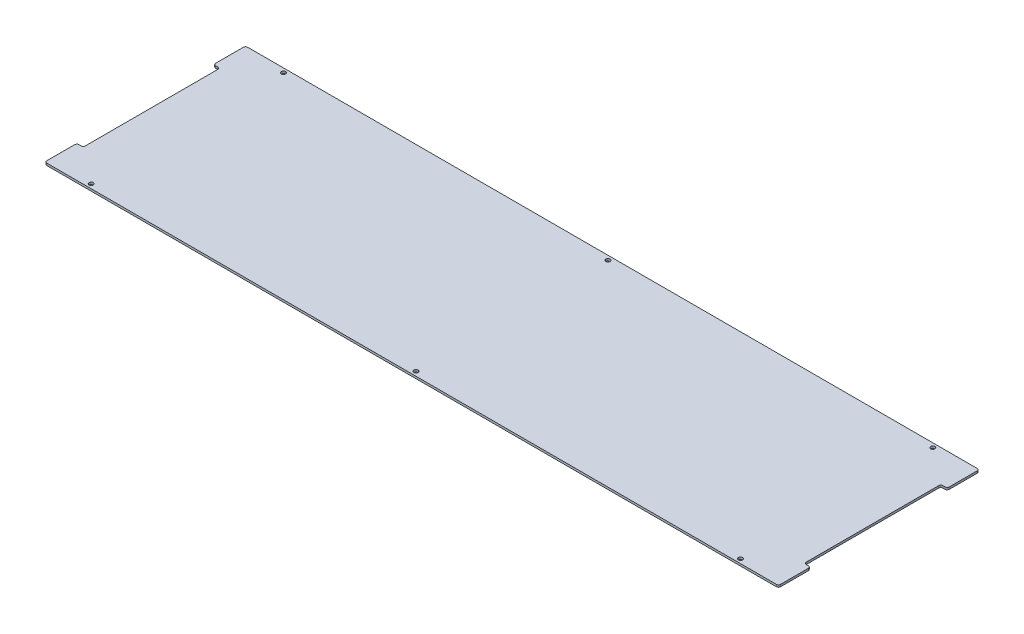
ISO-10303-21;
HEADER;
FILE_DESCRIPTION(('STEP AP214'),'2;1');
FILE_NAME('part.step','',(''),(''),'','','');
FILE_SCHEMA(('AUTOMOTIVE_DESIGN { 1 0 10303 214 1 1 1 1 }'));
ENDSEC;
DATA;
#1=APPLICATION_CONTEXT('core data for automotive mechanical design processes');
#2=APPLICATION_PROTOCOL_DEFINITION('international standard','automotive_design',2000,#1);
#3=PRODUCT_CONTEXT('',#1,'mechanical');
#4=PRODUCT('Part','Part','',(#3));
#5=PRODUCT_RELATED_PRODUCT_CATEGORY('part','',(#4));
#6=PRODUCT_DEFINITION_FORMATION('','',#4);
#7=PRODUCT_DEFINITION_CONTEXT('part definition',#1,'design');
#8=PRODUCT_DEFINITION('design','',#6,#7);
#9=PRODUCT_DEFINITION_SHAPE('','',#8);
#10=(LENGTH_UNIT() NAMED_UNIT(*) SI_UNIT(.MILLI.,.METRE.));
#11=(NAMED_UNIT(*) PLANE_ANGLE_UNIT() SI_UNIT($,.RADIAN.));
#12=(NAMED_UNIT(*) SI_UNIT($,.STERADIAN.) SOLID_ANGLE_UNIT());
#13=UNCERTAINTY_MEASURE_WITH_UNIT(LENGTH_MEASURE(1.E-05),#10,'distance_accuracy_value','');
#14=(GEOMETRIC_REPRESENTATION_CONTEXT(3) GLOBAL_UNCERTAINTY_ASSIGNED_CONTEXT((#13)) GLOBAL_UNIT_ASSIGNED_CONTEXT((#10,
#11,#12)) REPRESENTATION_CONTEXT('',''));
#15=CARTESIAN_POINT('',(0.,0.,0.));
#16=DIRECTION('',(0.,0.,1.));
#17=DIRECTION('',(1.,0.,0.));
#18=AXIS2_PLACEMENT_3D('',#15,#16,#17);
#19=CARTESIAN_POINT('',(0.,3.175,0.));
#20=DIRECTION('',(0.,-1.,0.));
#21=DIRECTION('',(0.,0.,-1.));
#22=AXIS2_PLACEMENT_3D('',#19,#20,#21);
#23=PLANE('',#22);
#24=CARTESIAN_POINT('',(482.6,3.175,142.875));
#25=DIRECTION('',(0.,1.,0.));
#26=DIRECTION('',(0.,0.,1.));
#27=AXIS2_PLACEMENT_3D('',#24,#25,#26);
#28=CIRCLE('',#27,3.17499999999998);
#29=CARTESIAN_POINT('',(482.6,3.175,146.05));
#30=VERTEX_POINT('',#29);
#31=EDGE_CURVE('E945',#30,#30,#28,.T.);
#32=ORIENTED_EDGE('',*,*,#31,.F.);
#33=EDGE_LOOP('',(#32));
#34=FACE_BOUND('',#33,.T.);
#35=CARTESIAN_POINT('',(-482.6,3.175,142.875));
#36=DIRECTION('',(0.,1.,0.));
#37=DIRECTION('',(0.,0.,1.));
#38=AXIS2_PLACEMENT_3D('',#35,#36,#37);
#39=CIRCLE('',#38,3.17499999999998);
#40=CARTESIAN_POINT('',(-482.6,3.175,146.05));
#41=VERTEX_POINT('',#40);
#42=EDGE_CURVE('E929',#41,#41,#39,.T.);
#43=ORIENTED_EDGE('',*,*,#42,.F.);
#44=EDGE_LOOP('',(#43));
#45=FACE_BOUND('',#44,.T.);
#46=CARTESIAN_POINT('',(482.6,3.175,-142.875));
#47=DIRECTION('',(0.,1.,0.));
#48=DIRECTION('',(0.,0.,1.));
#49=AXIS2_PLACEMENT_3D('',#46,#47,#48);
#50=CIRCLE('',#49,3.17499999999998);
#51=CARTESIAN_POINT('',(482.6,3.175,-139.7));
#52=VERTEX_POINT('',#51);
#53=EDGE_CURVE('E921',#52,#52,#50,.T.);
#54=ORIENTED_EDGE('',*,*,#53,.F.);
#55=EDGE_LOOP('',(#54));
#56=FACE_BOUND('',#55,.T.);
#57=CARTESIAN_POINT('',(0.,3.175,-142.875));
#58=DIRECTION('',(0.,1.,0.));
#59=DIRECTION('',(0.,0.,1.));
#60=AXIS2_PLACEMENT_3D('',#57,#58,#59);
#61=CIRCLE('',#60,3.17499999999999);
#62=CARTESIAN_POINT('',(0.,3.175,-139.7));
#63=VERTEX_POINT('',#62);
#64=EDGE_CURVE('E913',#63,#63,#61,.T.);
#65=ORIENTED_EDGE('',*,*,#64,.F.);
#66=EDGE_LOOP('',(#65));
#67=FACE_BOUND('',#66,.T.);
#68=CARTESIAN_POINT('',(-482.6,3.175,-142.875));
#69=DIRECTION('',(0.,1.,0.));
#70=DIRECTION('',(0.,0.,1.));
#71=AXIS2_PLACEMENT_3D('',#68,#69,#70);
#72=CIRCLE('',#71,3.17499999999998);
#73=CARTESIAN_POINT('',(-482.6,3.175,-139.7));
#74=VERTEX_POINT('',#73);
#75=EDGE_CURVE('E905',#74,#74,#72,.T.);
#76=ORIENTED_EDGE('',*,*,#75,.F.);
#77=EDGE_LOOP('',(#76));
#78=FACE_BOUND('',#77,.T.);
#79=DIRECTION('',(0.,0.,1.));
#80=VECTOR('',#79,1.);
#81=CARTESIAN_POINT('',(-545.30625,3.175,149.225));
#82=LINE('',#81,#80);
#83=CARTESIAN_POINT('',(-545.30625,3.175,104.775));
#84=VERTEX_POINT('',#83);
#85=CARTESIAN_POINT('',(-545.30625,3.175,146.05));
#86=VERTEX_POINT('',#85);
#87=EDGE_CURVE('E279',#84,#86,#82,.T.);
#88=ORIENTED_EDGE('',*,*,#87,.T.);
#89=CARTESIAN_POINT('',(-542.13125,3.175,146.05));
#90=DIRECTION('',(0.,-1.,0.));
#91=DIRECTION('',(0.,0.,-1.));
#92=AXIS2_PLACEMENT_3D('',#89,#90,#91);
#93=CIRCLE('',#92,3.175);
#94=CARTESIAN_POINT('',(-542.13125,3.175,149.225));
#95=VERTEX_POINT('',#94);
#96=EDGE_CURVE('E402',#86,#95,#93,.F.);
#97=ORIENTED_EDGE('',*,*,#96,.T.);
#98=DIRECTION('',(1.,0.,0.));
#99=VECTOR('',#98,1.);
#100=CARTESIAN_POINT('',(-545.30625,3.175,149.225));
#101=LINE('',#100,#99);
#102=CARTESIAN_POINT('',(542.13125,3.175,149.225));
#103=VERTEX_POINT('',#102);
#104=EDGE_CURVE('E251',#95,#103,#101,.T.);
#105=ORIENTED_EDGE('',*,*,#104,.T.);
#106=CARTESIAN_POINT('',(542.13125,3.175,146.05));
#107=DIRECTION('',(0.,-1.,0.));
#108=DIRECTION('',(0.,0.,-1.));
#109=AXIS2_PLACEMENT_3D('',#106,#107,#108);
#110=CIRCLE('',#109,3.175);
#111=CARTESIAN_POINT('',(545.30625,3.175,146.05));
#112=VERTEX_POINT('',#111);
#113=EDGE_CURVE('E392',#103,#112,#110,.F.);
#114=ORIENTED_EDGE('',*,*,#113,.T.);
#115=DIRECTION('',(0.,0.,-1.));
#116=VECTOR('',#115,1.);
#117=CARTESIAN_POINT('',(545.30625,3.175,149.225));
#118=LINE('',#117,#116);
#119=CARTESIAN_POINT('',(545.30625,3.175,104.775));
#120=VERTEX_POINT('',#119);
#121=EDGE_CURVE('E274',#112,#120,#118,.T.);
#122=ORIENTED_EDGE('',*,*,#121,.T.);
#123=CARTESIAN_POINT('',(542.13125,3.175,104.775));
#124=DIRECTION('',(0.,-1.,0.));
#125=DIRECTION('',(0.,0.,-1.));
#126=AXIS2_PLACEMENT_3D('',#123,#124,#125);
#127=CIRCLE('',#126,3.175);
#128=CARTESIAN_POINT('',(542.13125,3.175,101.6));
#129=VERTEX_POINT('',#128);
#130=EDGE_CURVE('E256',#120,#129,#127,.F.);
#131=ORIENTED_EDGE('',*,*,#130,.T.);
#132=DIRECTION('',(1.,0.,0.));
#133=VECTOR('',#132,1.);
#134=CARTESIAN_POINT('',(545.30625,3.175,101.6));
#135=LINE('',#134,#133);
#136=CARTESIAN_POINT('',(538.95625,3.175,101.6));
#137=VERTEX_POINT('',#136);
#138=EDGE_CURVE('E245',#137,#129,#135,.T.);
#139=ORIENTED_EDGE('',*,*,#138,.F.);
#140=CARTESIAN_POINT('',(538.95625,3.175,98.425));
#141=DIRECTION('',(0.,-1.,0.));
#142=DIRECTION('',(0.,0.,-1.));
#143=AXIS2_PLACEMENT_3D('',#140,#141,#142);
#144=CIRCLE('',#143,3.175);
#145=CARTESIAN_POINT('',(535.78125,3.175,98.4249999999999));
#146=VERTEX_POINT('',#145);
#147=EDGE_CURVE('E228',#137,#146,#144,.T.);
#148=ORIENTED_EDGE('',*,*,#147,.T.);
#149=DIRECTION('',(0.,0.,1.));
#150=VECTOR('',#149,1.);
#151=CARTESIAN_POINT('',(535.78125,3.175,-101.6));
#152=LINE('',#151,#150);
#153=CARTESIAN_POINT('',(535.78125,3.175,-98.425));
#154=VERTEX_POINT('',#153);
#155=EDGE_CURVE('E259',#154,#146,#152,.T.);
#156=ORIENTED_EDGE('',*,*,#155,.F.);
#157=CARTESIAN_POINT('',(538.95625,3.175,-98.425));
#158=DIRECTION('',(0.,-1.,0.));
#159=DIRECTION('',(0.,0.,-1.));
#160=AXIS2_PLACEMENT_3D('',#157,#158,#159);
#161=CIRCLE('',#160,3.175);
#162=CARTESIAN_POINT('',(538.95625,3.175,-101.6));
#163=VERTEX_POINT('',#162);
#164=EDGE_CURVE('E313',#154,#163,#161,.T.);
#165=ORIENTED_EDGE('',*,*,#164,.T.);
#166=DIRECTION('',(-1.,0.,0.));
#167=VECTOR('',#166,1.);
#168=CARTESIAN_POINT('',(545.30625,3.175,-101.6));
#169=LINE('',#168,#167);
#170=CARTESIAN_POINT('',(542.13125,3.175,-101.6));
#171=VERTEX_POINT('',#170);
#172=EDGE_CURVE('E266',#171,#163,#169,.T.);
#173=ORIENTED_EDGE('',*,*,#172,.F.);
#174=CARTESIAN_POINT('',(542.13125,3.175,-104.775));
#175=DIRECTION('',(0.,-1.,0.));
#176=DIRECTION('',(0.,0.,-1.));
#177=AXIS2_PLACEMENT_3D('',#174,#175,#176);
#178=CIRCLE('',#177,3.175);
#179=CARTESIAN_POINT('',(545.30625,3.175,-104.775));
#180=VERTEX_POINT('',#179);
#181=EDGE_CURVE('E387',#171,#180,#178,.F.);
#182=ORIENTED_EDGE('',*,*,#181,.T.);
#183=CARTESIAN_POINT('',(545.30625,3.175,-146.05));
#184=VERTEX_POINT('',#183);
#185=EDGE_CURVE('E270',#180,#184,#118,.T.);
#186=ORIENTED_EDGE('',*,*,#185,.T.);
#187=CARTESIAN_POINT('',(542.13125,3.175,-146.05));
#188=DIRECTION('',(0.,-1.,0.));
#189=DIRECTION('',(0.,0.,-1.));
#190=AXIS2_PLACEMENT_3D('',#187,#188,#189);
#191=CIRCLE('',#190,3.175);
#192=CARTESIAN_POINT('',(542.13125,3.175,-149.225));
#193=VERTEX_POINT('',#192);
#194=EDGE_CURVE('E384',#184,#193,#191,.F.);
#195=ORIENTED_EDGE('',*,*,#194,.T.);
#196=DIRECTION('',(-1.,0.,0.));
#197=VECTOR('',#196,1.);
#198=CARTESIAN_POINT('',(-545.30625,3.175,-149.225));
#199=LINE('',#198,#197);
#200=CARTESIAN_POINT('',(-542.13125,3.175,-149.225));
#201=VERTEX_POINT('',#200);
#202=EDGE_CURVE('E276',#193,#201,#199,.T.);
#203=ORIENTED_EDGE('',*,*,#202,.T.);
#204=CARTESIAN_POINT('',(-542.13125,3.175,-146.05));
#205=DIRECTION('',(0.,-1.,0.));
#206=DIRECTION('',(0.,0.,-1.));
#207=AXIS2_PLACEMENT_3D('',#204,#205,#206);
#208=CIRCLE('',#207,3.175);
#209=CARTESIAN_POINT('',(-545.30625,3.175,-146.05));
#210=VERTEX_POINT('',#209);
#211=EDGE_CURVE('E88',#201,#210,#208,.F.);
#212=ORIENTED_EDGE('',*,*,#211,.T.);
#213=CARTESIAN_POINT('',(-545.30625,3.175,-104.775));
#214=VERTEX_POINT('',#213);
#215=EDGE_CURVE('E280',#210,#214,#82,.T.);
#216=ORIENTED_EDGE('',*,*,#215,.T.);
#217=CARTESIAN_POINT('',(-542.13125,3.175,-104.775));
#218=DIRECTION('',(0.,-1.,0.));
#219=DIRECTION('',(0.,0.,-1.));
#220=AXIS2_PLACEMENT_3D('',#217,#218,#219);
#221=CIRCLE('',#220,3.175);
#222=CARTESIAN_POINT('',(-542.13125,3.175,-101.6));
#223=VERTEX_POINT('',#222);
#224=EDGE_CURVE('E80',#214,#223,#221,.F.);
#225=ORIENTED_EDGE('',*,*,#224,.T.);
#226=DIRECTION('',(1.,0.,0.));
#227=VECTOR('',#226,1.);
#228=CARTESIAN_POINT('',(-545.30625,3.175,-101.6));
#229=LINE('',#228,#227);
#230=CARTESIAN_POINT('',(-538.95625,3.175,-101.6));
#231=VERTEX_POINT('',#230);
#232=EDGE_CURVE('E470',#223,#231,#229,.T.);
#233=ORIENTED_EDGE('',*,*,#232,.T.);
#234=CARTESIAN_POINT('',(-538.95625,3.175,-98.425));
#235=DIRECTION('',(0.,-1.,0.));
#236=DIRECTION('',(0.,0.,-1.));
#237=AXIS2_PLACEMENT_3D('',#234,#235,#236);
#238=CIRCLE('',#237,3.175);
#239=CARTESIAN_POINT('',(-535.78125,3.175,-98.425));
#240=VERTEX_POINT('',#239);
#241=EDGE_CURVE('E340',#231,#240,#238,.T.);
#242=ORIENTED_EDGE('',*,*,#241,.T.);
#243=DIRECTION('',(0.,0.,1.));
#244=VECTOR('',#243,1.);
#245=CARTESIAN_POINT('',(-535.78125,3.175,-101.6));
#246=LINE('',#245,#244);
#247=CARTESIAN_POINT('',(-535.78125,3.175,98.4249999999999));
#248=VERTEX_POINT('',#247);
#249=EDGE_CURVE('E478',#240,#248,#246,.T.);
#250=ORIENTED_EDGE('',*,*,#249,.T.);
#251=CARTESIAN_POINT('',(-538.95625,3.175,98.425));
#252=DIRECTION('',(0.,-1.,0.));
#253=DIRECTION('',(0.,0.,-1.));
#254=AXIS2_PLACEMENT_3D('',#251,#252,#253);
#255=CIRCLE('',#254,3.175);
#256=CARTESIAN_POINT('',(-538.95625,3.175,101.6));
#257=VERTEX_POINT('',#256);
#258=EDGE_CURVE('E334',#248,#257,#255,.T.);
#259=ORIENTED_EDGE('',*,*,#258,.T.);
#260=DIRECTION('',(-1.,0.,0.));
#261=VECTOR('',#260,1.);
#262=CARTESIAN_POINT('',(-545.30625,3.175,101.6));
#263=LINE('',#262,#261);
#264=CARTESIAN_POINT('',(-542.13125,3.175,101.6));
#265=VERTEX_POINT('',#264);
#266=EDGE_CURVE('E495',#257,#265,#263,.T.);
#267=ORIENTED_EDGE('',*,*,#266,.T.);
#268=CARTESIAN_POINT('',(-542.13125,3.175,104.775));
#269=DIRECTION('',(0.,-1.,0.));
#270=DIRECTION('',(0.,0.,-1.));
#271=AXIS2_PLACEMENT_3D('',#268,#269,#270);
#272=CIRCLE('',#271,3.175);
#273=EDGE_CURVE('E399',#265,#84,#272,.F.);
#274=ORIENTED_EDGE('',*,*,#273,.T.);
#275=EDGE_LOOP('',(#88,#97,#105,#114,#122,#131,#139,#148,#156,#165,#173,#182,#186,#195,#203,
#212,#216,#225,#233,#242,#250,#259,#267,#274));
#276=FACE_BOUND('',#275,.T.);
#277=CARTESIAN_POINT('',(0.,3.175,142.875));
#278=DIRECTION('',(0.,1.,0.));
#279=DIRECTION('',(0.,0.,1.));
#280=AXIS2_PLACEMENT_3D('',#277,#278,#279);
#281=CIRCLE('',#280,3.17499999999999);
#282=CARTESIAN_POINT('',(0.,3.175,146.05));
#283=VERTEX_POINT('',#282);
#284=EDGE_CURVE('E937',#283,#283,#281,.T.);
#285=ORIENTED_EDGE('',*,*,#284,.F.);
#286=EDGE_LOOP('',(#285));
#287=FACE_BOUND('',#286,.T.);
#288=ADVANCED_FACE('F64',(#34,#45,#56,#67,#78,#276,#287),#23,.F.);
#289=CARTESIAN_POINT('',(0.,0.,0.));
#290=DIRECTION('',(0.,-1.,0.));
#291=DIRECTION('',(0.,0.,-1.));
#292=AXIS2_PLACEMENT_3D('',#289,#290,#291);
#293=PLANE('',#292);
#294=CARTESIAN_POINT('',(482.6,0.,142.875));
#295=DIRECTION('',(0.,1.,0.));
#296=DIRECTION('',(0.,0.,1.));
#297=AXIS2_PLACEMENT_3D('',#294,#295,#296);
#298=CIRCLE('',#297,3.17499999999998);
#299=CARTESIAN_POINT('',(482.6,0.,146.05));
#300=VERTEX_POINT('',#299);
#301=EDGE_CURVE('E941',#300,#300,#298,.T.);
#302=ORIENTED_EDGE('',*,*,#301,.T.);
#303=EDGE_LOOP('',(#302));
#304=FACE_BOUND('',#303,.T.);
#305=DIRECTION('',(1.,0.,0.));
#306=VECTOR('',#305,1.);
#307=CARTESIAN_POINT('',(-545.30625,0.,149.225));
#308=LINE('',#307,#306);
#309=CARTESIAN_POINT('',(-542.13125,0.,149.225));
#310=VERTEX_POINT('',#309);
#311=CARTESIAN_POINT('',(542.13125,0.,149.225));
#312=VERTEX_POINT('',#311);
#313=EDGE_CURVE('E275',#310,#312,#308,.T.);
#314=ORIENTED_EDGE('',*,*,#313,.F.);
#315=CARTESIAN_POINT('',(-542.13125,0.,146.05));
#316=DIRECTION('',(0.,-1.,0.));
#317=DIRECTION('',(0.,0.,-1.));
#318=AXIS2_PLACEMENT_3D('',#315,#316,#317);
#319=CIRCLE('',#318,3.175);
#320=CARTESIAN_POINT('',(-545.30625,0.,146.05));
#321=VERTEX_POINT('',#320);
#322=EDGE_CURVE('E375',#310,#321,#319,.T.);
#323=ORIENTED_EDGE('',*,*,#322,.T.);
#324=DIRECTION('',(0.,0.,1.));
#325=VECTOR('',#324,1.);
#326=CARTESIAN_POINT('',(-545.30625,0.,149.225));
#327=LINE('',#326,#325);
#328=CARTESIAN_POINT('',(-545.30625,0.,104.775));
#329=VERTEX_POINT('',#328);
#330=EDGE_CURVE('E295',#329,#321,#327,.T.);
#331=ORIENTED_EDGE('',*,*,#330,.F.);
#332=CARTESIAN_POINT('',(-542.13125,0.,104.775));
#333=DIRECTION('',(0.,-1.,0.));
#334=DIRECTION('',(0.,0.,-1.));
#335=AXIS2_PLACEMENT_3D('',#332,#333,#334);
#336=CIRCLE('',#335,3.175);
#337=CARTESIAN_POINT('',(-542.13125,0.,101.6));
#338=VERTEX_POINT('',#337);
#339=EDGE_CURVE('E372',#329,#338,#336,.T.);
#340=ORIENTED_EDGE('',*,*,#339,.T.);
#341=DIRECTION('',(-1.,0.,0.));
#342=VECTOR('',#341,1.);
#343=CARTESIAN_POINT('',(-545.30625,0.,101.6));
#344=LINE('',#343,#342);
#345=CARTESIAN_POINT('',(-538.95625,0.,101.6));
#346=VERTEX_POINT('',#345);
#347=EDGE_CURVE('E477',#346,#338,#344,.T.);
#348=ORIENTED_EDGE('',*,*,#347,.F.);
#349=CARTESIAN_POINT('',(-538.95625,0.,98.425));
#350=DIRECTION('',(0.,-1.,0.));
#351=DIRECTION('',(0.,0.,-1.));
#352=AXIS2_PLACEMENT_3D('',#349,#350,#351);
#353=CIRCLE('',#352,3.175);
#354=CARTESIAN_POINT('',(-535.78125,0.,98.4249999999999));
#355=VERTEX_POINT('',#354);
#356=EDGE_CURVE('E337',#346,#355,#353,.F.);
#357=ORIENTED_EDGE('',*,*,#356,.T.);
#358=DIRECTION('',(0.,0.,1.));
#359=VECTOR('',#358,1.);
#360=CARTESIAN_POINT('',(-535.78125,0.,-101.6));
#361=LINE('',#360,#359);
#362=CARTESIAN_POINT('',(-535.78125,0.,-98.425));
#363=VERTEX_POINT('',#362);
#364=EDGE_CURVE('E486',#363,#355,#361,.T.);
#365=ORIENTED_EDGE('',*,*,#364,.F.);
#366=CARTESIAN_POINT('',(-538.95625,0.,-98.425));
#367=DIRECTION('',(0.,-1.,0.));
#368=DIRECTION('',(0.,0.,-1.));
#369=AXIS2_PLACEMENT_3D('',#366,#367,#368);
#370=CIRCLE('',#369,3.175);
#371=CARTESIAN_POINT('',(-538.95625,0.,-101.6));
#372=VERTEX_POINT('',#371);
#373=EDGE_CURVE('E343',#363,#372,#370,.F.);
#374=ORIENTED_EDGE('',*,*,#373,.T.);
#375=DIRECTION('',(1.,0.,0.));
#376=VECTOR('',#375,1.);
#377=CARTESIAN_POINT('',(-545.30625,0.,-101.6));
#378=LINE('',#377,#376);
#379=CARTESIAN_POINT('',(-542.13125,0.,-101.6));
#380=VERTEX_POINT('',#379);
#381=EDGE_CURVE('E482',#380,#372,#378,.T.);
#382=ORIENTED_EDGE('',*,*,#381,.F.);
#383=CARTESIAN_POINT('',(-542.13125,0.,-104.775));
#384=DIRECTION('',(0.,-1.,0.));
#385=DIRECTION('',(0.,0.,-1.));
#386=AXIS2_PLACEMENT_3D('',#383,#384,#385);
#387=CIRCLE('',#386,3.175);
#388=CARTESIAN_POINT('',(-545.30625,0.,-104.775));
#389=VERTEX_POINT('',#388);
#390=EDGE_CURVE('E369',#380,#389,#387,.T.);
#391=ORIENTED_EDGE('',*,*,#390,.T.);
#392=CARTESIAN_POINT('',(-545.30625,0.,-146.05));
#393=VERTEX_POINT('',#392);
#394=EDGE_CURVE('E299',#393,#389,#327,.T.);
#395=ORIENTED_EDGE('',*,*,#394,.F.);
#396=CARTESIAN_POINT('',(-542.13125,0.,-146.05));
#397=DIRECTION('',(0.,-1.,0.));
#398=DIRECTION('',(0.,0.,-1.));
#399=AXIS2_PLACEMENT_3D('',#396,#397,#398);
#400=CIRCLE('',#399,3.175);
#401=CARTESIAN_POINT('',(-542.13125,0.,-149.225));
#402=VERTEX_POINT('',#401);
#403=EDGE_CURVE('E366',#393,#402,#400,.T.);
#404=ORIENTED_EDGE('',*,*,#403,.T.);
#405=DIRECTION('',(-1.,0.,0.));
#406=VECTOR('',#405,1.);
#407=CARTESIAN_POINT('',(-545.30625,0.,-149.225));
#408=LINE('',#407,#406);
#409=CARTESIAN_POINT('',(542.13125,0.,-149.225));
#410=VERTEX_POINT('',#409);
#411=EDGE_CURVE('E290',#410,#402,#408,.T.);
#412=ORIENTED_EDGE('',*,*,#411,.F.);
#413=CARTESIAN_POINT('',(542.13125,0.,-146.05));
#414=DIRECTION('',(0.,-1.,0.));
#415=DIRECTION('',(0.,0.,-1.));
#416=AXIS2_PLACEMENT_3D('',#413,#414,#415);
#417=CIRCLE('',#416,3.175);
#418=CARTESIAN_POINT('',(545.30625,0.,-146.05));
#419=VERTEX_POINT('',#418);
#420=EDGE_CURVE('E354',#410,#419,#417,.T.);
#421=ORIENTED_EDGE('',*,*,#420,.T.);
#422=DIRECTION('',(0.,0.,-1.));
#423=VECTOR('',#422,1.);
#424=CARTESIAN_POINT('',(545.30625,0.,149.225));
#425=LINE('',#424,#423);
#426=CARTESIAN_POINT('',(545.30625,0.,-104.775));
#427=VERTEX_POINT('',#426);
#428=EDGE_CURVE('E291',#427,#419,#425,.T.);
#429=ORIENTED_EDGE('',*,*,#428,.F.);
#430=CARTESIAN_POINT('',(542.13125,0.,-104.775));
#431=DIRECTION('',(0.,-1.,0.));
#432=DIRECTION('',(0.,0.,-1.));
#433=AXIS2_PLACEMENT_3D('',#430,#431,#432);
#434=CIRCLE('',#433,3.175);
#435=CARTESIAN_POINT('',(542.13125,0.,-101.6));
#436=VERTEX_POINT('',#435);
#437=EDGE_CURVE('E357',#427,#436,#434,.T.);
#438=ORIENTED_EDGE('',*,*,#437,.T.);
#439=DIRECTION('',(-1.,0.,0.));
#440=VECTOR('',#439,1.);
#441=CARTESIAN_POINT('',(545.30625,0.,-101.6));
#442=LINE('',#441,#440);
#443=CARTESIAN_POINT('',(538.95625,0.,-101.6));
#444=VERTEX_POINT('',#443);
#445=EDGE_CURVE('E258',#436,#444,#442,.T.);
#446=ORIENTED_EDGE('',*,*,#445,.T.);
#447=CARTESIAN_POINT('',(538.95625,0.,-98.425));
#448=DIRECTION('',(0.,-1.,0.));
#449=DIRECTION('',(0.,0.,-1.));
#450=AXIS2_PLACEMENT_3D('',#447,#448,#449);
#451=CIRCLE('',#450,3.175);
#452=CARTESIAN_POINT('',(535.78125,0.,-98.425));
#453=VERTEX_POINT('',#452);
#454=EDGE_CURVE('E317',#444,#453,#451,.F.);
#455=ORIENTED_EDGE('',*,*,#454,.T.);
#456=DIRECTION('',(0.,0.,1.));
#457=VECTOR('',#456,1.);
#458=CARTESIAN_POINT('',(535.78125,0.,-101.6));
#459=LINE('',#458,#457);
#460=CARTESIAN_POINT('',(535.78125,0.,98.4249999999999));
#461=VERTEX_POINT('',#460);
#462=EDGE_CURVE('E264',#453,#461,#459,.T.);
#463=ORIENTED_EDGE('',*,*,#462,.T.);
#464=CARTESIAN_POINT('',(538.95625,0.,98.425));
#465=DIRECTION('',(0.,-1.,0.));
#466=DIRECTION('',(0.,0.,-1.));
#467=AXIS2_PLACEMENT_3D('',#464,#465,#466);
#468=CIRCLE('',#467,3.175);
#469=CARTESIAN_POINT('',(538.95625,0.,101.6));
#470=VERTEX_POINT('',#469);
#471=EDGE_CURVE('E238',#461,#470,#468,.F.);
#472=ORIENTED_EDGE('',*,*,#471,.T.);
#473=DIRECTION('',(1.,0.,0.));
#474=VECTOR('',#473,1.);
#475=CARTESIAN_POINT('',(545.30625,0.,101.6));
#476=LINE('',#475,#474);
#477=CARTESIAN_POINT('',(542.13125,0.,101.6));
#478=VERTEX_POINT('',#477);
#479=EDGE_CURVE('E248',#470,#478,#476,.T.);
#480=ORIENTED_EDGE('',*,*,#479,.T.);
#481=CARTESIAN_POINT('',(542.13125,0.,104.775));
#482=DIRECTION('',(0.,-1.,0.));
#483=DIRECTION('',(0.,0.,-1.));
#484=AXIS2_PLACEMENT_3D('',#481,#482,#483);
#485=CIRCLE('',#484,3.175);
#486=CARTESIAN_POINT('',(545.30625,0.,104.775));
#487=VERTEX_POINT('',#486);
#488=EDGE_CURVE('E360',#478,#487,#485,.T.);
#489=ORIENTED_EDGE('',*,*,#488,.T.);
#490=CARTESIAN_POINT('',(545.30625,0.,146.05));
#491=VERTEX_POINT('',#490);
#492=EDGE_CURVE('E286',#491,#487,#425,.T.);
#493=ORIENTED_EDGE('',*,*,#492,.F.);
#494=CARTESIAN_POINT('',(542.13125,0.,146.05));
#495=DIRECTION('',(0.,-1.,0.));
#496=DIRECTION('',(0.,0.,-1.));
#497=AXIS2_PLACEMENT_3D('',#494,#495,#496);
#498=CIRCLE('',#497,3.175);
#499=EDGE_CURVE('E363',#491,#312,#498,.T.);
#500=ORIENTED_EDGE('',*,*,#499,.T.);
#501=EDGE_LOOP('',(#314,#323,#331,#340,#348,#357,#365,#374,#382,#391,#395,#404,#412,#421,#429,
#438,#446,#455,#463,#472,#480,#489,#493,#500));
#502=FACE_BOUND('',#501,.T.);
#503=CARTESIAN_POINT('',(-482.6,0.,-142.875));
#504=DIRECTION('',(0.,1.,0.));
#505=DIRECTION('',(0.,0.,1.));
#506=AXIS2_PLACEMENT_3D('',#503,#504,#505);
#507=CIRCLE('',#506,3.17499999999998);
#508=CARTESIAN_POINT('',(-482.6,0.,-139.7));
#509=VERTEX_POINT('',#508);
#510=EDGE_CURVE('E499',#509,#509,#507,.T.);
#511=ORIENTED_EDGE('',*,*,#510,.T.);
#512=EDGE_LOOP('',(#511));
#513=FACE_BOUND('',#512,.T.);
#514=CARTESIAN_POINT('',(0.,0.,-142.875));
#515=DIRECTION('',(0.,1.,0.));
#516=DIRECTION('',(0.,0.,1.));
#517=AXIS2_PLACEMENT_3D('',#514,#515,#516);
#518=CIRCLE('',#517,3.175);
#519=CARTESIAN_POINT('',(0.,0.,-139.7));
#520=VERTEX_POINT('',#519);
#521=EDGE_CURVE('E909',#520,#520,#518,.T.);
#522=ORIENTED_EDGE('',*,*,#521,.T.);
#523=EDGE_LOOP('',(#522));
#524=FACE_BOUND('',#523,.T.);
#525=CARTESIAN_POINT('',(482.6,0.,-142.875));
#526=DIRECTION('',(0.,1.,0.));
#527=DIRECTION('',(0.,0.,1.));
#528=AXIS2_PLACEMENT_3D('',#525,#526,#527);
#529=CIRCLE('',#528,3.17499999999998);
#530=CARTESIAN_POINT('',(482.6,0.,-139.7));
#531=VERTEX_POINT('',#530);
#532=EDGE_CURVE('E917',#531,#531,#529,.T.);
#533=ORIENTED_EDGE('',*,*,#532,.T.);
#534=EDGE_LOOP('',(#533));
#535=FACE_BOUND('',#534,.T.);
#536=CARTESIAN_POINT('',(-482.6,0.,142.875));
#537=DIRECTION('',(0.,1.,0.));
#538=DIRECTION('',(0.,0.,1.));
#539=AXIS2_PLACEMENT_3D('',#536,#537,#538);
#540=CIRCLE('',#539,3.17499999999998);
#541=CARTESIAN_POINT('',(-482.6,0.,146.05));
#542=VERTEX_POINT('',#541);
#543=EDGE_CURVE('E925',#542,#542,#540,.T.);
#544=ORIENTED_EDGE('',*,*,#543,.T.);
#545=EDGE_LOOP('',(#544));
#546=FACE_BOUND('',#545,.T.);
#547=CARTESIAN_POINT('',(0.,0.,142.875));
#548=DIRECTION('',(0.,1.,0.));
#549=DIRECTION('',(0.,0.,1.));
#550=AXIS2_PLACEMENT_3D('',#547,#548,#549);
#551=CIRCLE('',#550,3.175);
#552=CARTESIAN_POINT('',(0.,0.,146.05));
#553=VERTEX_POINT('',#552);
#554=EDGE_CURVE('E933',#553,#553,#551,.T.);
#555=ORIENTED_EDGE('',*,*,#554,.T.);
#556=EDGE_LOOP('',(#555));
#557=FACE_BOUND('',#556,.T.);
#558=ADVANCED_FACE('F460',(#304,#502,#513,#524,#535,#546,#557),#293,.T.);
#559=CARTESIAN_POINT('',(-545.30625,3.175,149.225));
#560=DIRECTION('',(1.,0.,0.));
#561=DIRECTION('',(0.,0.,-1.));
#562=AXIS2_PLACEMENT_3D('',#559,#560,#561);
#563=PLANE('',#562);
#564=ORIENTED_EDGE('',*,*,#394,.T.);
#565=DIRECTION('',(0.,1.,0.));
#566=VECTOR('',#565,1.);
#567=CARTESIAN_POINT('',(-545.30625,3.175,-104.775));
#568=LINE('',#567,#566);
#569=EDGE_CURVE('E413',#389,#214,#568,.T.);
#570=ORIENTED_EDGE('',*,*,#569,.T.);
#571=ORIENTED_EDGE('',*,*,#215,.F.);
#572=DIRECTION('',(0.,-1.,0.));
#573=VECTOR('',#572,1.);
#574=CARTESIAN_POINT('',(-545.30625,3.175,-146.05));
#575=LINE('',#574,#573);
#576=EDGE_CURVE('E409',#210,#393,#575,.T.);
#577=ORIENTED_EDGE('',*,*,#576,.T.);
#578=EDGE_LOOP('',(#564,#570,#571,#577));
#579=FACE_BOUND('',#578,.T.);
#580=ADVANCED_FACE('F468',(#579),#563,.F.);
#581=ORIENTED_EDGE('',*,*,#330,.T.);
#582=DIRECTION('',(0.,-1.,0.));
#583=VECTOR('',#582,1.);
#584=CARTESIAN_POINT('',(-545.30625,3.175,146.05));
#585=LINE('',#584,#583);
#586=EDGE_CURVE('E381',#321,#86,#585,.F.);
#587=ORIENTED_EDGE('',*,*,#586,.T.);
#588=ORIENTED_EDGE('',*,*,#87,.F.);
#589=DIRECTION('',(0.,1.,0.));
#590=VECTOR('',#589,1.);
#591=CARTESIAN_POINT('',(-545.30625,0.,104.775));
#592=LINE('',#591,#590);
#593=EDGE_CURVE('E378',#84,#329,#592,.F.);
#594=ORIENTED_EDGE('',*,*,#593,.T.);
#595=EDGE_LOOP('',(#581,#587,#588,#594));
#596=FACE_BOUND('',#595,.T.);
#597=ADVANCED_FACE('F622',(#596),#563,.F.);
#598=CARTESIAN_POINT('',(545.30625,3.175,149.225));
#599=DIRECTION('',(-1.,0.,0.));
#600=DIRECTION('',(0.,0.,1.));
#601=AXIS2_PLACEMENT_3D('',#598,#599,#600);
#602=PLANE('',#601);
#603=ORIENTED_EDGE('',*,*,#121,.F.);
#604=DIRECTION('',(0.,-1.,0.));
#605=VECTOR('',#604,1.);
#606=CARTESIAN_POINT('',(545.30625,3.175,146.05));
#607=LINE('',#606,#605);
#608=EDGE_CURVE('E430',#112,#491,#607,.T.);
#609=ORIENTED_EDGE('',*,*,#608,.T.);
#610=ORIENTED_EDGE('',*,*,#492,.T.);
#611=DIRECTION('',(0.,1.,0.));
#612=VECTOR('',#611,1.);
#613=CARTESIAN_POINT('',(545.30625,3.175,104.775));
#614=LINE('',#613,#612);
#615=EDGE_CURVE('E426',#487,#120,#614,.T.);
#616=ORIENTED_EDGE('',*,*,#615,.T.);
#617=EDGE_LOOP('',(#603,#609,#610,#616));
#618=FACE_BOUND('',#617,.T.);
#619=ADVANCED_FACE('F591',(#618),#602,.F.);
#620=ORIENTED_EDGE('',*,*,#185,.F.);
#621=DIRECTION('',(0.,1.,0.));
#622=VECTOR('',#621,1.);
#623=CARTESIAN_POINT('',(545.30625,3.175,-104.775));
#624=LINE('',#623,#622);
#625=EDGE_CURVE('E12',#180,#427,#624,.F.);
#626=ORIENTED_EDGE('',*,*,#625,.T.);
#627=ORIENTED_EDGE('',*,*,#428,.T.);
#628=DIRECTION('',(0.,-1.,0.));
#629=VECTOR('',#628,1.);
#630=CARTESIAN_POINT('',(545.30625,3.175,-146.05));
#631=LINE('',#630,#629);
#632=EDGE_CURVE('E73',#419,#184,#631,.F.);
#633=ORIENTED_EDGE('',*,*,#632,.T.);
#634=EDGE_LOOP('',(#620,#626,#627,#633));
#635=FACE_BOUND('',#634,.T.);
#636=ADVANCED_FACE('F446',(#635),#602,.F.);
#637=CARTESIAN_POINT('',(-545.30625,3.175,-149.225));
#638=DIRECTION('',(0.,0.,1.));
#639=DIRECTION('',(1.,0.,0.));
#640=AXIS2_PLACEMENT_3D('',#637,#638,#639);
#641=PLANE('',#640);
#642=ORIENTED_EDGE('',*,*,#411,.T.);
#643=DIRECTION('',(0.,-1.,0.));
#644=VECTOR('',#643,1.);
#645=CARTESIAN_POINT('',(-542.13125,3.175,-149.225));
#646=LINE('',#645,#644);
#647=EDGE_CURVE('E423',#402,#201,#646,.F.);
#648=ORIENTED_EDGE('',*,*,#647,.T.);
#649=ORIENTED_EDGE('',*,*,#202,.F.);
#650=DIRECTION('',(0.,-1.,0.));
#651=VECTOR('',#650,1.);
#652=CARTESIAN_POINT('',(542.13125,3.175,-149.225));
#653=LINE('',#652,#651);
#654=EDGE_CURVE('E419',#193,#410,#653,.T.);
#655=ORIENTED_EDGE('',*,*,#654,.T.);
#656=EDGE_LOOP('',(#642,#648,#649,#655));
#657=FACE_BOUND('',#656,.T.);
#658=ADVANCED_FACE('F456',(#657),#641,.F.);
#659=CARTESIAN_POINT('',(-545.30625,3.175,149.225));
#660=DIRECTION('',(0.,0.,-1.));
#661=DIRECTION('',(-1.,0.,0.));
#662=AXIS2_PLACEMENT_3D('',#659,#660,#661);
#663=PLANE('',#662);
#664=ORIENTED_EDGE('',*,*,#104,.F.);
#665=DIRECTION('',(0.,-1.,0.));
#666=VECTOR('',#665,1.);
#667=CARTESIAN_POINT('',(-542.13125,3.175,149.225));
#668=LINE('',#667,#666);
#669=EDGE_CURVE('E350',#95,#310,#668,.T.);
#670=ORIENTED_EDGE('',*,*,#669,.T.);
#671=ORIENTED_EDGE('',*,*,#313,.T.);
#672=DIRECTION('',(0.,-1.,0.));
#673=VECTOR('',#672,1.);
#674=CARTESIAN_POINT('',(542.13125,3.175,149.225));
#675=LINE('',#674,#673);
#676=EDGE_CURVE('E347',#312,#103,#675,.F.);
#677=ORIENTED_EDGE('',*,*,#676,.T.);
#678=EDGE_LOOP('',(#664,#670,#671,#677));
#679=FACE_BOUND('',#678,.T.);
#680=ADVANCED_FACE('F581',(#679),#663,.F.);
#681=CARTESIAN_POINT('',(545.30625,0.,101.6));
#682=DIRECTION('',(0.,0.,1.));
#683=DIRECTION('',(1.,0.,0.));
#684=AXIS2_PLACEMENT_3D('',#681,#682,#683);
#685=PLANE('',#684);
#686=ORIENTED_EDGE('',*,*,#138,.T.);
#687=DIRECTION('',(0.,1.,0.));
#688=VECTOR('',#687,1.);
#689=CARTESIAN_POINT('',(542.13125,0.,101.6));
#690=LINE('',#689,#688);
#691=EDGE_CURVE('E434',#129,#478,#690,.F.);
#692=ORIENTED_EDGE('',*,*,#691,.T.);
#693=ORIENTED_EDGE('',*,*,#479,.F.);
#694=DIRECTION('',(0.,1.,0.));
#695=VECTOR('',#694,1.);
#696=CARTESIAN_POINT('',(538.95625,3.175,101.6));
#697=LINE('',#696,#695);
#698=EDGE_CURVE('E232',#470,#137,#697,.T.);
#699=ORIENTED_EDGE('',*,*,#698,.T.);
#700=EDGE_LOOP('',(#686,#692,#693,#699));
#701=FACE_BOUND('',#700,.T.);
#702=ADVANCED_FACE('F244',(#701),#685,.F.);
#703=CARTESIAN_POINT('',(535.78125,0.,-101.6));
#704=DIRECTION('',(-1.,0.,0.));
#705=DIRECTION('',(0.,0.,1.));
#706=AXIS2_PLACEMENT_3D('',#703,#704,#705);
#707=PLANE('',#706);
#708=ORIENTED_EDGE('',*,*,#155,.T.);
#709=DIRECTION('',(0.,1.,0.));
#710=VECTOR('',#709,1.);
#711=CARTESIAN_POINT('',(535.78125,0.,98.425));
#712=LINE('',#711,#710);
#713=EDGE_CURVE('E233',#146,#461,#712,.F.);
#714=ORIENTED_EDGE('',*,*,#713,.T.);
#715=ORIENTED_EDGE('',*,*,#462,.F.);
#716=DIRECTION('',(0.,1.,0.));
#717=VECTOR('',#716,1.);
#718=CARTESIAN_POINT('',(535.78125,3.175,-98.425));
#719=LINE('',#718,#717);
#720=EDGE_CURVE('E250',#453,#154,#719,.T.);
#721=ORIENTED_EDGE('',*,*,#720,.T.);
#722=EDGE_LOOP('',(#708,#714,#715,#721));
#723=FACE_BOUND('',#722,.T.);
#724=ADVANCED_FACE('F822',(#723),#707,.F.);
#725=CARTESIAN_POINT('',(545.30625,0.,-101.6));
#726=DIRECTION('',(0.,0.,-1.));
#727=DIRECTION('',(-1.,0.,0.));
#728=AXIS2_PLACEMENT_3D('',#725,#726,#727);
#729=PLANE('',#728);
#730=ORIENTED_EDGE('',*,*,#445,.F.);
#731=DIRECTION('',(0.,1.,0.));
#732=VECTOR('',#731,1.);
#733=CARTESIAN_POINT('',(542.13125,0.,-101.6));
#734=LINE('',#733,#732);
#735=EDGE_CURVE('E437',#436,#171,#734,.T.);
#736=ORIENTED_EDGE('',*,*,#735,.T.);
#737=ORIENTED_EDGE('',*,*,#172,.T.);
#738=DIRECTION('',(0.,1.,0.));
#739=VECTOR('',#738,1.);
#740=CARTESIAN_POINT('',(538.95625,0.,-101.6));
#741=LINE('',#740,#739);
#742=EDGE_CURVE('E239',#163,#444,#741,.F.);
#743=ORIENTED_EDGE('',*,*,#742,.T.);
#744=EDGE_LOOP('',(#730,#736,#737,#743));
#745=FACE_BOUND('',#744,.T.);
#746=ADVANCED_FACE('F615',(#745),#729,.F.);
#747=CARTESIAN_POINT('',(538.95625,0.,98.425));
#748=DIRECTION('',(0.,-1.,0.));
#749=DIRECTION('',(0.,0.,-1.));
#750=AXIS2_PLACEMENT_3D('',#747,#748,#749);
#751=CYLINDRICAL_SURFACE('',#750,3.175);
#752=ORIENTED_EDGE('',*,*,#471,.F.);
#753=ORIENTED_EDGE('',*,*,#713,.F.);
#754=ORIENTED_EDGE('',*,*,#147,.F.);
#755=ORIENTED_EDGE('',*,*,#698,.F.);
#756=EDGE_LOOP('',(#752,#753,#754,#755));
#757=FACE_BOUND('',#756,.T.);
#758=ADVANCED_FACE('F231',(#757),#751,.F.);
#759=CARTESIAN_POINT('',(538.95625,0.,-98.425));
#760=DIRECTION('',(0.,-1.,0.));
#761=DIRECTION('',(0.,0.,-1.));
#762=AXIS2_PLACEMENT_3D('',#759,#760,#761);
#763=CYLINDRICAL_SURFACE('',#762,3.175);
#764=ORIENTED_EDGE('',*,*,#454,.F.);
#765=ORIENTED_EDGE('',*,*,#742,.F.);
#766=ORIENTED_EDGE('',*,*,#164,.F.);
#767=ORIENTED_EDGE('',*,*,#720,.F.);
#768=EDGE_LOOP('',(#764,#765,#766,#767));
#769=FACE_BOUND('',#768,.T.);
#770=ADVANCED_FACE('F629',(#769),#763,.F.);
#771=CARTESIAN_POINT('',(-545.30625,0.,-101.6));
#772=DIRECTION('',(0.,0.,1.));
#773=DIRECTION('',(1.,0.,0.));
#774=AXIS2_PLACEMENT_3D('',#771,#772,#773);
#775=PLANE('',#774);
#776=ORIENTED_EDGE('',*,*,#232,.F.);
#777=DIRECTION('',(0.,1.,0.));
#778=VECTOR('',#777,1.);
#779=CARTESIAN_POINT('',(-542.13125,0.,-101.6));
#780=LINE('',#779,#778);
#781=EDGE_CURVE('E416',#223,#380,#780,.F.);
#782=ORIENTED_EDGE('',*,*,#781,.T.);
#783=ORIENTED_EDGE('',*,*,#381,.T.);
#784=DIRECTION('',(0.,1.,0.));
#785=VECTOR('',#784,1.);
#786=CARTESIAN_POINT('',(-538.95625,3.175,-101.6));
#787=LINE('',#786,#785);
#788=EDGE_CURVE('E330',#372,#231,#787,.T.);
#789=ORIENTED_EDGE('',*,*,#788,.T.);
#790=EDGE_LOOP('',(#776,#782,#783,#789));
#791=FACE_BOUND('',#790,.T.);
#792=ADVANCED_FACE('F473',(#791),#775,.T.);
#793=CARTESIAN_POINT('',(-535.78125,0.,-101.6));
#794=DIRECTION('',(-1.,0.,0.));
#795=DIRECTION('',(0.,0.,1.));
#796=AXIS2_PLACEMENT_3D('',#793,#794,#795);
#797=PLANE('',#796);
#798=ORIENTED_EDGE('',*,*,#364,.T.);
#799=DIRECTION('',(0.,1.,0.));
#800=VECTOR('',#799,1.);
#801=CARTESIAN_POINT('',(-535.78125,3.175,98.425));
#802=LINE('',#801,#800);
#803=EDGE_CURVE('E323',#355,#248,#802,.T.);
#804=ORIENTED_EDGE('',*,*,#803,.T.);
#805=ORIENTED_EDGE('',*,*,#249,.F.);
#806=DIRECTION('',(0.,1.,0.));
#807=VECTOR('',#806,1.);
#808=CARTESIAN_POINT('',(-535.78125,0.,-98.425));
#809=LINE('',#808,#807);
#810=EDGE_CURVE('E320',#240,#363,#809,.F.);
#811=ORIENTED_EDGE('',*,*,#810,.T.);
#812=EDGE_LOOP('',(#798,#804,#805,#811));
#813=FACE_BOUND('',#812,.T.);
#814=ADVANCED_FACE('F777',(#813),#797,.T.);
#815=CARTESIAN_POINT('',(-545.30625,0.,101.6));
#816=DIRECTION('',(0.,0.,-1.));
#817=DIRECTION('',(-1.,0.,0.));
#818=AXIS2_PLACEMENT_3D('',#815,#816,#817);
#819=PLANE('',#818);
#820=ORIENTED_EDGE('',*,*,#347,.T.);
#821=DIRECTION('',(0.,1.,0.));
#822=VECTOR('',#821,1.);
#823=CARTESIAN_POINT('',(-542.13125,3.175,101.6));
#824=LINE('',#823,#822);
#825=EDGE_CURVE('E405',#338,#265,#824,.T.);
#826=ORIENTED_EDGE('',*,*,#825,.T.);
#827=ORIENTED_EDGE('',*,*,#266,.F.);
#828=DIRECTION('',(0.,1.,0.));
#829=VECTOR('',#828,1.);
#830=CARTESIAN_POINT('',(-538.95625,0.,101.6));
#831=LINE('',#830,#829);
#832=EDGE_CURVE('E327',#257,#346,#831,.F.);
#833=ORIENTED_EDGE('',*,*,#832,.T.);
#834=EDGE_LOOP('',(#820,#826,#827,#833));
#835=FACE_BOUND('',#834,.T.);
#836=ADVANCED_FACE('F637',(#835),#819,.T.);
#837=CARTESIAN_POINT('',(-538.95625,0.,98.425));
#838=DIRECTION('',(0.,-1.,0.));
#839=DIRECTION('',(0.,0.,-1.));
#840=AXIS2_PLACEMENT_3D('',#837,#838,#839);
#841=CYLINDRICAL_SURFACE('',#840,3.175);
#842=ORIENTED_EDGE('',*,*,#356,.F.);
#843=ORIENTED_EDGE('',*,*,#832,.F.);
#844=ORIENTED_EDGE('',*,*,#258,.F.);
#845=ORIENTED_EDGE('',*,*,#803,.F.);
#846=EDGE_LOOP('',(#842,#843,#844,#845));
#847=FACE_BOUND('',#846,.T.);
#848=ADVANCED_FACE('F633',(#847),#841,.F.);
#849=CARTESIAN_POINT('',(-538.95625,0.,-98.425));
#850=DIRECTION('',(0.,-1.,0.));
#851=DIRECTION('',(0.,0.,-1.));
#852=AXIS2_PLACEMENT_3D('',#849,#850,#851);
#853=CYLINDRICAL_SURFACE('',#852,3.175);
#854=ORIENTED_EDGE('',*,*,#373,.F.);
#855=ORIENTED_EDGE('',*,*,#810,.F.);
#856=ORIENTED_EDGE('',*,*,#241,.F.);
#857=ORIENTED_EDGE('',*,*,#788,.F.);
#858=EDGE_LOOP('',(#854,#855,#856,#857));
#859=FACE_BOUND('',#858,.T.);
#860=ADVANCED_FACE('F636',(#859),#853,.F.);
#861=CARTESIAN_POINT('',(-482.6,3.175,-142.875));
#862=DIRECTION('',(0.,1.,0.));
#863=DIRECTION('',(0.,0.,1.));
#864=AXIS2_PLACEMENT_3D('',#861,#862,#863);
#865=CYLINDRICAL_SURFACE('',#864,3.17499999999998);
#866=ORIENTED_EDGE('',*,*,#510,.F.);
#867=EDGE_LOOP('',(#866));
#868=FACE_BOUND('',#867,.T.);
#869=ORIENTED_EDGE('',*,*,#75,.T.);
#870=EDGE_LOOP('',(#869));
#871=FACE_BOUND('',#870,.T.);
#872=ADVANCED_FACE('F641',(#868,#871),#865,.F.);
#873=CARTESIAN_POINT('',(0.,3.175,-142.875));
#874=DIRECTION('',(0.,1.,0.));
#875=DIRECTION('',(0.,0.,1.));
#876=AXIS2_PLACEMENT_3D('',#873,#874,#875);
#877=CYLINDRICAL_SURFACE('',#876,3.17499999999999);
#878=ORIENTED_EDGE('',*,*,#521,.F.);
#879=EDGE_LOOP('',(#878));
#880=FACE_BOUND('',#879,.T.);
#881=ORIENTED_EDGE('',*,*,#64,.T.);
#882=EDGE_LOOP('',(#881));
#883=FACE_BOUND('',#882,.T.);
#884=ADVANCED_FACE('F742',(#880,#883),#877,.F.);
#885=CARTESIAN_POINT('',(482.6,3.175,-142.875));
#886=DIRECTION('',(0.,1.,0.));
#887=DIRECTION('',(0.,0.,1.));
#888=AXIS2_PLACEMENT_3D('',#885,#886,#887);
#889=CYLINDRICAL_SURFACE('',#888,3.17499999999998);
#890=ORIENTED_EDGE('',*,*,#532,.F.);
#891=EDGE_LOOP('',(#890));
#892=FACE_BOUND('',#891,.T.);
#893=ORIENTED_EDGE('',*,*,#53,.T.);
#894=EDGE_LOOP('',(#893));
#895=FACE_BOUND('',#894,.T.);
#896=ADVANCED_FACE('F723',(#892,#895),#889,.F.);
#897=CARTESIAN_POINT('',(-482.6,3.175,142.875));
#898=DIRECTION('',(0.,1.,0.));
#899=DIRECTION('',(0.,0.,1.));
#900=AXIS2_PLACEMENT_3D('',#897,#898,#899);
#901=CYLINDRICAL_SURFACE('',#900,3.17499999999998);
#902=ORIENTED_EDGE('',*,*,#543,.F.);
#903=EDGE_LOOP('',(#902));
#904=FACE_BOUND('',#903,.T.);
#905=ORIENTED_EDGE('',*,*,#42,.T.);
#906=EDGE_LOOP('',(#905));
#907=FACE_BOUND('',#906,.T.);
#908=ADVANCED_FACE('F714',(#904,#907),#901,.F.);
#909=CARTESIAN_POINT('',(0.,3.175,142.875));
#910=DIRECTION('',(0.,1.,0.));
#911=DIRECTION('',(0.,0.,1.));
#912=AXIS2_PLACEMENT_3D('',#909,#910,#911);
#913=CYLINDRICAL_SURFACE('',#912,3.17499999999999);
#914=ORIENTED_EDGE('',*,*,#554,.F.);
#915=EDGE_LOOP('',(#914));
#916=FACE_BOUND('',#915,.T.);
#917=ORIENTED_EDGE('',*,*,#284,.T.);
#918=EDGE_LOOP('',(#917));
#919=FACE_BOUND('',#918,.T.);
#920=ADVANCED_FACE('F705',(#916,#919),#913,.F.);
#921=CARTESIAN_POINT('',(482.6,3.175,142.875));
#922=DIRECTION('',(0.,1.,0.));
#923=DIRECTION('',(0.,0.,1.));
#924=AXIS2_PLACEMENT_3D('',#921,#922,#923);
#925=CYLINDRICAL_SURFACE('',#924,3.17499999999998);
#926=ORIENTED_EDGE('',*,*,#301,.F.);
#927=EDGE_LOOP('',(#926));
#928=FACE_BOUND('',#927,.T.);
#929=ORIENTED_EDGE('',*,*,#31,.T.);
#930=EDGE_LOOP('',(#929));
#931=FACE_BOUND('',#930,.T.);
#932=ADVANCED_FACE('F646',(#928,#931),#925,.F.);
#933=CARTESIAN_POINT('',(-542.13125,3.175,146.05));
#934=DIRECTION('',(0.,-1.,0.));
#935=DIRECTION('',(0.,0.,-1.));
#936=AXIS2_PLACEMENT_3D('',#933,#934,#935);
#937=CYLINDRICAL_SURFACE('',#936,3.175);
#938=ORIENTED_EDGE('',*,*,#96,.F.);
#939=ORIENTED_EDGE('',*,*,#586,.F.);
#940=ORIENTED_EDGE('',*,*,#322,.F.);
#941=ORIENTED_EDGE('',*,*,#669,.F.);
#942=EDGE_LOOP('',(#938,#939,#940,#941));
#943=FACE_BOUND('',#942,.T.);
#944=ADVANCED_FACE('F579',(#943),#937,.T.);
#945=CARTESIAN_POINT('',(-542.13125,0.,104.775));
#946=DIRECTION('',(0.,-1.,0.));
#947=DIRECTION('',(0.,0.,-1.));
#948=AXIS2_PLACEMENT_3D('',#945,#946,#947);
#949=CYLINDRICAL_SURFACE('',#948,3.175);
#950=ORIENTED_EDGE('',*,*,#339,.F.);
#951=ORIENTED_EDGE('',*,*,#593,.F.);
#952=ORIENTED_EDGE('',*,*,#273,.F.);
#953=ORIENTED_EDGE('',*,*,#825,.F.);
#954=EDGE_LOOP('',(#950,#951,#952,#953));
#955=FACE_BOUND('',#954,.T.);
#956=ADVANCED_FACE('F645',(#955),#949,.T.);
#957=CARTESIAN_POINT('',(-542.13125,3.175,-104.775));
#958=DIRECTION('',(0.,-1.,0.));
#959=DIRECTION('',(0.,0.,-1.));
#960=AXIS2_PLACEMENT_3D('',#957,#958,#959);
#961=CYLINDRICAL_SURFACE('',#960,3.175);
#962=ORIENTED_EDGE('',*,*,#390,.F.);
#963=ORIENTED_EDGE('',*,*,#781,.F.);
#964=ORIENTED_EDGE('',*,*,#224,.F.);
#965=ORIENTED_EDGE('',*,*,#569,.F.);
#966=EDGE_LOOP('',(#962,#963,#964,#965));
#967=FACE_BOUND('',#966,.T.);
#968=ADVANCED_FACE('F481',(#967),#961,.T.);
#969=CARTESIAN_POINT('',(-542.13125,3.175,-146.05));
#970=DIRECTION('',(0.,-1.,0.));
#971=DIRECTION('',(0.,0.,-1.));
#972=AXIS2_PLACEMENT_3D('',#969,#970,#971);
#973=CYLINDRICAL_SURFACE('',#972,3.175);
#974=ORIENTED_EDGE('',*,*,#211,.F.);
#975=ORIENTED_EDGE('',*,*,#647,.F.);
#976=ORIENTED_EDGE('',*,*,#403,.F.);
#977=ORIENTED_EDGE('',*,*,#576,.F.);
#978=EDGE_LOOP('',(#974,#975,#976,#977));
#979=FACE_BOUND('',#978,.T.);
#980=ADVANCED_FACE('F466',(#979),#973,.T.);
#981=CARTESIAN_POINT('',(542.13125,3.175,146.05));
#982=DIRECTION('',(0.,-1.,0.));
#983=DIRECTION('',(0.,0.,-1.));
#984=AXIS2_PLACEMENT_3D('',#981,#982,#983);
#985=CYLINDRICAL_SURFACE('',#984,3.175);
#986=ORIENTED_EDGE('',*,*,#113,.F.);
#987=ORIENTED_EDGE('',*,*,#676,.F.);
#988=ORIENTED_EDGE('',*,*,#499,.F.);
#989=ORIENTED_EDGE('',*,*,#608,.F.);
#990=EDGE_LOOP('',(#986,#987,#988,#989));
#991=FACE_BOUND('',#990,.T.);
#992=ADVANCED_FACE('F588',(#991),#985,.T.);
#993=CARTESIAN_POINT('',(542.13125,3.175,104.775));
#994=DIRECTION('',(0.,1.,0.));
#995=DIRECTION('',(0.,0.,1.));
#996=AXIS2_PLACEMENT_3D('',#993,#994,#995);
#997=CYLINDRICAL_SURFACE('',#996,3.175);
#998=ORIENTED_EDGE('',*,*,#488,.F.);
#999=ORIENTED_EDGE('',*,*,#691,.F.);
#1000=ORIENTED_EDGE('',*,*,#130,.F.);
#1001=ORIENTED_EDGE('',*,*,#615,.F.);
#1002=EDGE_LOOP('',(#998,#999,#1000,#1001));
#1003=FACE_BOUND('',#1002,.T.);
#1004=ADVANCED_FACE('F594',(#1003),#997,.T.);
#1005=CARTESIAN_POINT('',(542.13125,0.,-104.775));
#1006=DIRECTION('',(0.,1.,0.));
#1007=DIRECTION('',(0.,0.,1.));
#1008=AXIS2_PLACEMENT_3D('',#1005,#1006,#1007);
#1009=CYLINDRICAL_SURFACE('',#1008,3.175);
#1010=ORIENTED_EDGE('',*,*,#437,.F.);
#1011=ORIENTED_EDGE('',*,*,#625,.F.);
#1012=ORIENTED_EDGE('',*,*,#181,.F.);
#1013=ORIENTED_EDGE('',*,*,#735,.F.);
#1014=EDGE_LOOP('',(#1010,#1011,#1012,#1013));
#1015=FACE_BOUND('',#1014,.T.);
#1016=ADVANCED_FACE('F596',(#1015),#1009,.T.);
#1017=CARTESIAN_POINT('',(542.13125,3.175,-146.05));
#1018=DIRECTION('',(0.,-1.,0.));
#1019=DIRECTION('',(0.,0.,-1.));
#1020=AXIS2_PLACEMENT_3D('',#1017,#1018,#1019);
#1021=CYLINDRICAL_SURFACE('',#1020,3.175);
#1022=ORIENTED_EDGE('',*,*,#194,.F.);
#1023=ORIENTED_EDGE('',*,*,#632,.F.);
#1024=ORIENTED_EDGE('',*,*,#420,.F.);
#1025=ORIENTED_EDGE('',*,*,#654,.F.);
#1026=EDGE_LOOP('',(#1022,#1023,#1024,#1025));
#1027=FACE_BOUND('',#1026,.T.);
#1028=ADVANCED_FACE('F66',(#1027),#1021,.T.);
#1029=CLOSED_SHELL('',(#288,#558,#580,#597,#619,#636,#658,#680,#702,#724,#746,#758,#770,#792,
#814,#836,#848,#860,#872,#884,#896,#908,#920,#932,#944,#956,#968,#980,#992,#1004,#1016,#1028));
#1030=MANIFOLD_SOLID_BREP('B2',#1029);
#1031=ADVANCED_BREP_SHAPE_REPRESENTATION('',(#18,#1030),#14);
#1032=SHAPE_DEFINITION_REPRESENTATION(#9,#1031);
ENDSEC;
END-ISO-10303-21;
